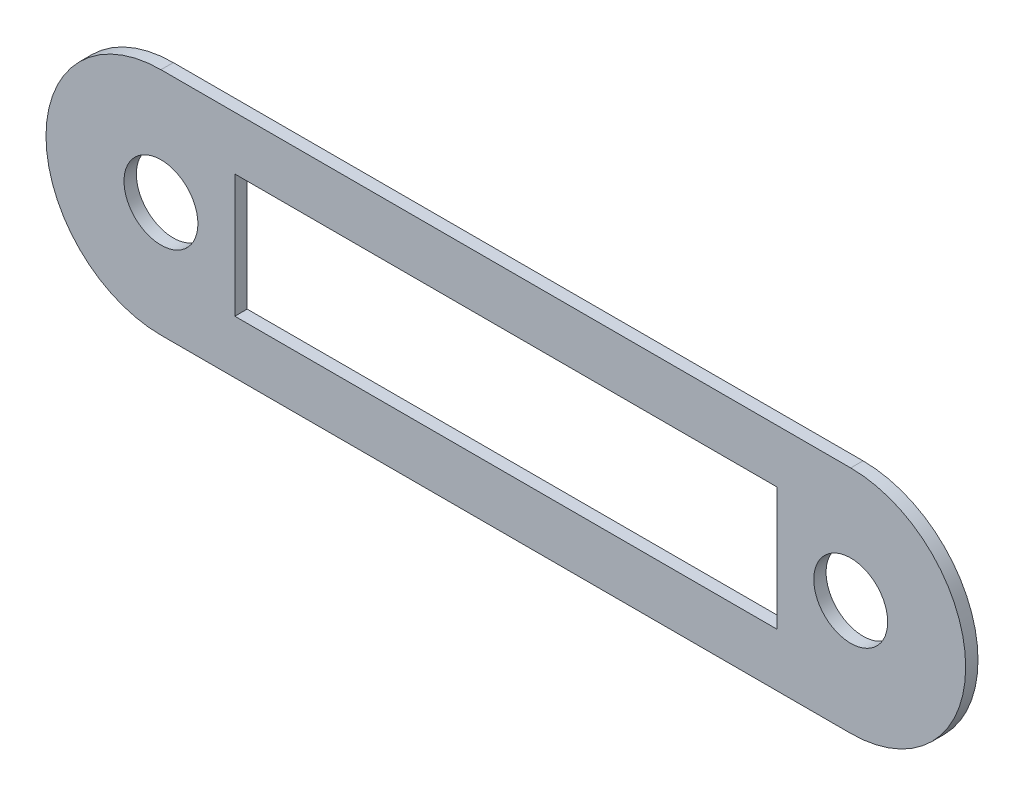
ISO-10303-21;
HEADER;
FILE_DESCRIPTION(('STEP AP214'),'2;1');
FILE_NAME('part.step','',(''),(''),'','','');
FILE_SCHEMA(('AUTOMOTIVE_DESIGN { 1 0 10303 214 1 1 1 1 }'));
ENDSEC;
DATA;
#1=APPLICATION_CONTEXT('core data for automotive mechanical design processes');
#2=APPLICATION_PROTOCOL_DEFINITION('international standard','automotive_design',2000,#1);
#3=PRODUCT_CONTEXT('',#1,'mechanical');
#4=PRODUCT('Part','Part','',(#3));
#5=PRODUCT_RELATED_PRODUCT_CATEGORY('part','',(#4));
#6=PRODUCT_DEFINITION_FORMATION('','',#4);
#7=PRODUCT_DEFINITION_CONTEXT('part definition',#1,'design');
#8=PRODUCT_DEFINITION('design','',#6,#7);
#9=PRODUCT_DEFINITION_SHAPE('','',#8);
#10=(LENGTH_UNIT() NAMED_UNIT(*) SI_UNIT(.MILLI.,.METRE.));
#11=(NAMED_UNIT(*) PLANE_ANGLE_UNIT() SI_UNIT($,.RADIAN.));
#12=(NAMED_UNIT(*) SI_UNIT($,.STERADIAN.) SOLID_ANGLE_UNIT());
#13=UNCERTAINTY_MEASURE_WITH_UNIT(LENGTH_MEASURE(1.E-05),#10,'distance_accuracy_value','');
#14=(GEOMETRIC_REPRESENTATION_CONTEXT(3) GLOBAL_UNCERTAINTY_ASSIGNED_CONTEXT((#13)) GLOBAL_UNIT_ASSIGNED_CONTEXT((#10,
#11,#12)) REPRESENTATION_CONTEXT('',''));
#15=CARTESIAN_POINT('',(0.,0.,0.));
#16=DIRECTION('',(0.,0.,1.));
#17=DIRECTION('',(1.,0.,0.));
#18=AXIS2_PLACEMENT_3D('',#15,#16,#17);
#19=CARTESIAN_POINT('',(0.,0.,0.5));
#20=DIRECTION('',(0.,0.,1.));
#21=DIRECTION('',(1.,0.,0.));
#22=AXIS2_PLACEMENT_3D('',#19,#20,#21);
#23=PLANE('',#22);
#24=CARTESIAN_POINT('',(28.,0.,0.5));
#25=DIRECTION('',(0.,0.,1.));
#26=DIRECTION('',(1.,0.,0.));
#27=AXIS2_PLACEMENT_3D('',#24,#25,#26);
#28=CIRCLE('',#27,1.5);
#29=CARTESIAN_POINT('',(29.5,0.,0.5));
#30=VERTEX_POINT('',#29);
#31=EDGE_CURVE('E115',#30,#30,#28,.T.);
#32=ORIENTED_EDGE('',*,*,#31,.F.);
#33=EDGE_LOOP('',(#32));
#34=FACE_BOUND('',#33,.T.);
#35=CARTESIAN_POINT('',(0.,0.,0.5));
#36=DIRECTION('',(0.,0.,1.));
#37=DIRECTION('',(1.,0.,0.));
#38=AXIS2_PLACEMENT_3D('',#35,#36,#37);
#39=CIRCLE('',#38,1.5);
#40=CARTESIAN_POINT('',(1.5,0.,0.5));
#41=VERTEX_POINT('',#40);
#42=EDGE_CURVE('E138',#41,#41,#39,.T.);
#43=ORIENTED_EDGE('',*,*,#42,.F.);
#44=EDGE_LOOP('',(#43));
#45=FACE_BOUND('',#44,.T.);
#46=CARTESIAN_POINT('',(0.,0.,0.5));
#47=DIRECTION('',(0.,0.,1.));
#48=DIRECTION('',(1.,0.,0.));
#49=AXIS2_PLACEMENT_3D('',#46,#47,#48);
#50=CIRCLE('',#49,4.66666666666667);
#51=CARTESIAN_POINT('',(0.,4.66666666666667,0.5));
#52=VERTEX_POINT('',#51);
#53=CARTESIAN_POINT('',(0.,-4.66666666666667,0.5));
#54=VERTEX_POINT('',#53);
#55=EDGE_CURVE('E147',#52,#54,#50,.T.);
#56=ORIENTED_EDGE('',*,*,#55,.T.);
#57=DIRECTION('',(1.,0.,0.));
#58=VECTOR('',#57,1.);
#59=CARTESIAN_POINT('',(0.,-4.66666666666667,0.5));
#60=LINE('',#59,#58);
#61=CARTESIAN_POINT('',(28.,-4.66666666666667,0.5));
#62=VERTEX_POINT('',#61);
#63=EDGE_CURVE('E150',#54,#62,#60,.T.);
#64=ORIENTED_EDGE('',*,*,#63,.T.);
#65=CARTESIAN_POINT('',(28.,0.,0.5));
#66=DIRECTION('',(0.,0.,1.));
#67=DIRECTION('',(1.,0.,0.));
#68=AXIS2_PLACEMENT_3D('',#65,#66,#67);
#69=CIRCLE('',#68,4.66666666666667);
#70=CARTESIAN_POINT('',(28.,4.66666666666667,0.5));
#71=VERTEX_POINT('',#70);
#72=EDGE_CURVE('E153',#62,#71,#69,.T.);
#73=ORIENTED_EDGE('',*,*,#72,.T.);
#74=DIRECTION('',(-1.,0.,0.));
#75=VECTOR('',#74,1.);
#76=CARTESIAN_POINT('',(0.,4.66666666666667,0.5));
#77=LINE('',#76,#75);
#78=EDGE_CURVE('E155',#71,#52,#77,.T.);
#79=ORIENTED_EDGE('',*,*,#78,.T.);
#80=EDGE_LOOP('',(#56,#64,#73,#79));
#81=FACE_BOUND('',#80,.T.);
#82=DIRECTION('',(-1.,0.,0.));
#83=VECTOR('',#82,1.);
#84=CARTESIAN_POINT('',(25.,2.5,0.5));
#85=LINE('',#84,#83);
#86=CARTESIAN_POINT('',(25.,2.5,0.5));
#87=VERTEX_POINT('',#86);
#88=CARTESIAN_POINT('',(3.,2.5,0.5));
#89=VERTEX_POINT('',#88);
#90=EDGE_CURVE('E109',#87,#89,#85,.T.);
#91=ORIENTED_EDGE('',*,*,#90,.F.);
#92=DIRECTION('',(0.,-1.,0.));
#93=VECTOR('',#92,1.);
#94=CARTESIAN_POINT('',(25.,2.5,0.5));
#95=LINE('',#94,#93);
#96=CARTESIAN_POINT('',(25.,-2.5,0.5));
#97=VERTEX_POINT('',#96);
#98=EDGE_CURVE('E49',#87,#97,#95,.T.);
#99=ORIENTED_EDGE('',*,*,#98,.T.);
#100=DIRECTION('',(-1.,0.,0.));
#101=VECTOR('',#100,1.);
#102=CARTESIAN_POINT('',(25.,-2.5,0.5));
#103=LINE('',#102,#101);
#104=CARTESIAN_POINT('',(3.,-2.5,0.5));
#105=VERTEX_POINT('',#104);
#106=EDGE_CURVE('E114',#97,#105,#103,.T.);
#107=ORIENTED_EDGE('',*,*,#106,.T.);
#108=DIRECTION('',(0.,-1.,0.));
#109=VECTOR('',#108,1.);
#110=CARTESIAN_POINT('',(3.,2.5,0.5));
#111=LINE('',#110,#109);
#112=EDGE_CURVE('E126',#89,#105,#111,.T.);
#113=ORIENTED_EDGE('',*,*,#112,.F.);
#114=EDGE_LOOP('',(#91,#99,#107,#113));
#115=FACE_BOUND('',#114,.T.);
#116=ADVANCED_FACE('F34',(#34,#45,#81,#115),#23,.T.);
#117=CARTESIAN_POINT('',(0.,0.,0.));
#118=DIRECTION('',(0.,0.,1.));
#119=DIRECTION('',(1.,0.,0.));
#120=AXIS2_PLACEMENT_3D('',#117,#118,#119);
#121=PLANE('',#120);
#122=CARTESIAN_POINT('',(0.,0.,0.));
#123=DIRECTION('',(0.,0.,1.));
#124=DIRECTION('',(1.,0.,0.));
#125=AXIS2_PLACEMENT_3D('',#122,#123,#124);
#126=CIRCLE('',#125,4.66666666666667);
#127=CARTESIAN_POINT('',(0.,4.66666666666667,0.));
#128=VERTEX_POINT('',#127);
#129=CARTESIAN_POINT('',(0.,-4.66666666666667,0.));
#130=VERTEX_POINT('',#129);
#131=EDGE_CURVE('E144',#128,#130,#126,.T.);
#132=ORIENTED_EDGE('',*,*,#131,.F.);
#133=DIRECTION('',(-1.,0.,0.));
#134=VECTOR('',#133,1.);
#135=CARTESIAN_POINT('',(0.,4.66666666666667,0.));
#136=LINE('',#135,#134);
#137=CARTESIAN_POINT('',(28.,4.66666666666667,0.));
#138=VERTEX_POINT('',#137);
#139=EDGE_CURVE('E151',#138,#128,#136,.T.);
#140=ORIENTED_EDGE('',*,*,#139,.F.);
#141=CARTESIAN_POINT('',(28.,0.,0.));
#142=DIRECTION('',(0.,0.,1.));
#143=DIRECTION('',(1.,0.,0.));
#144=AXIS2_PLACEMENT_3D('',#141,#142,#143);
#145=CIRCLE('',#144,4.66666666666667);
#146=CARTESIAN_POINT('',(28.,-4.66666666666667,0.));
#147=VERTEX_POINT('',#146);
#148=EDGE_CURVE('E162',#147,#138,#145,.T.);
#149=ORIENTED_EDGE('',*,*,#148,.F.);
#150=DIRECTION('',(1.,0.,0.));
#151=VECTOR('',#150,1.);
#152=CARTESIAN_POINT('',(0.,-4.66666666666667,0.));
#153=LINE('',#152,#151);
#154=EDGE_CURVE('E160',#130,#147,#153,.T.);
#155=ORIENTED_EDGE('',*,*,#154,.F.);
#156=EDGE_LOOP('',(#132,#140,#149,#155));
#157=FACE_BOUND('',#156,.T.);
#158=CARTESIAN_POINT('',(0.,0.,0.));
#159=DIRECTION('',(0.,0.,1.));
#160=DIRECTION('',(1.,0.,0.));
#161=AXIS2_PLACEMENT_3D('',#158,#159,#160);
#162=CIRCLE('',#161,1.5);
#163=CARTESIAN_POINT('',(1.5,0.,0.));
#164=VERTEX_POINT('',#163);
#165=EDGE_CURVE('E141',#164,#164,#162,.T.);
#166=ORIENTED_EDGE('',*,*,#165,.T.);
#167=EDGE_LOOP('',(#166));
#168=FACE_BOUND('',#167,.T.);
#169=CARTESIAN_POINT('',(28.,0.,0.));
#170=DIRECTION('',(0.,0.,1.));
#171=DIRECTION('',(1.,0.,0.));
#172=AXIS2_PLACEMENT_3D('',#169,#170,#171);
#173=CIRCLE('',#172,1.5);
#174=CARTESIAN_POINT('',(29.5,0.,0.));
#175=VERTEX_POINT('',#174);
#176=EDGE_CURVE('E135',#175,#175,#173,.T.);
#177=ORIENTED_EDGE('',*,*,#176,.T.);
#178=EDGE_LOOP('',(#177));
#179=FACE_BOUND('',#178,.T.);
#180=DIRECTION('',(0.,-1.,0.));
#181=VECTOR('',#180,1.);
#182=CARTESIAN_POINT('',(25.,2.5,0.));
#183=LINE('',#182,#181);
#184=CARTESIAN_POINT('',(25.,2.5,0.));
#185=VERTEX_POINT('',#184);
#186=CARTESIAN_POINT('',(25.,-2.5,0.));
#187=VERTEX_POINT('',#186);
#188=EDGE_CURVE('E99',#185,#187,#183,.T.);
#189=ORIENTED_EDGE('',*,*,#188,.F.);
#190=DIRECTION('',(-1.,0.,0.));
#191=VECTOR('',#190,1.);
#192=CARTESIAN_POINT('',(25.,2.5,0.));
#193=LINE('',#192,#191);
#194=CARTESIAN_POINT('',(3.,2.5,0.));
#195=VERTEX_POINT('',#194);
#196=EDGE_CURVE('E120',#185,#195,#193,.T.);
#197=ORIENTED_EDGE('',*,*,#196,.T.);
#198=DIRECTION('',(0.,-1.,0.));
#199=VECTOR('',#198,1.);
#200=CARTESIAN_POINT('',(3.,2.5,0.));
#201=LINE('',#200,#199);
#202=CARTESIAN_POINT('',(3.,-2.5,0.));
#203=VERTEX_POINT('',#202);
#204=EDGE_CURVE('E57',#195,#203,#201,.T.);
#205=ORIENTED_EDGE('',*,*,#204,.T.);
#206=DIRECTION('',(-1.,0.,0.));
#207=VECTOR('',#206,1.);
#208=CARTESIAN_POINT('',(25.,-2.5,0.));
#209=LINE('',#208,#207);
#210=EDGE_CURVE('E108',#187,#203,#209,.T.);
#211=ORIENTED_EDGE('',*,*,#210,.F.);
#212=EDGE_LOOP('',(#189,#197,#205,#211));
#213=FACE_BOUND('',#212,.T.);
#214=ADVANCED_FACE('F118',(#157,#168,#179,#213),#121,.F.);
#215=CARTESIAN_POINT('',(0.,0.,0.5));
#216=DIRECTION('',(0.,0.,-1.));
#217=DIRECTION('',(-1.,0.,0.));
#218=AXIS2_PLACEMENT_3D('',#215,#216,#217);
#219=CYLINDRICAL_SURFACE('',#218,4.66666666666667);
#220=ORIENTED_EDGE('',*,*,#131,.T.);
#221=DIRECTION('',(0.,0.,-1.));
#222=VECTOR('',#221,1.);
#223=CARTESIAN_POINT('',(0.,-4.66666666666667,0.5));
#224=LINE('',#223,#222);
#225=EDGE_CURVE('E11',#54,#130,#224,.T.);
#226=ORIENTED_EDGE('',*,*,#225,.F.);
#227=ORIENTED_EDGE('',*,*,#55,.F.);
#228=DIRECTION('',(0.,0.,-1.));
#229=VECTOR('',#228,1.);
#230=CARTESIAN_POINT('',(0.,4.66666666666667,0.5));
#231=LINE('',#230,#229);
#232=EDGE_CURVE('E157',#52,#128,#231,.T.);
#233=ORIENTED_EDGE('',*,*,#232,.T.);
#234=EDGE_LOOP('',(#220,#226,#227,#233));
#235=FACE_BOUND('',#234,.T.);
#236=ADVANCED_FACE('F36',(#235),#219,.T.);
#237=CARTESIAN_POINT('',(0.,-4.66666666666667,0.5));
#238=DIRECTION('',(0.,1.,0.));
#239=DIRECTION('',(0.,0.,1.));
#240=AXIS2_PLACEMENT_3D('',#237,#238,#239);
#241=PLANE('',#240);
#242=ORIENTED_EDGE('',*,*,#154,.T.);
#243=DIRECTION('',(0.,0.,-1.));
#244=VECTOR('',#243,1.);
#245=CARTESIAN_POINT('',(28.,-4.66666666666667,0.5));
#246=LINE('',#245,#244);
#247=EDGE_CURVE('E42',#62,#147,#246,.T.);
#248=ORIENTED_EDGE('',*,*,#247,.F.);
#249=ORIENTED_EDGE('',*,*,#63,.F.);
#250=ORIENTED_EDGE('',*,*,#225,.T.);
#251=EDGE_LOOP('',(#242,#248,#249,#250));
#252=FACE_BOUND('',#251,.T.);
#253=ADVANCED_FACE('F190',(#252),#241,.F.);
#254=CARTESIAN_POINT('',(28.,0.,0.5));
#255=DIRECTION('',(0.,0.,-1.));
#256=DIRECTION('',(-1.,0.,0.));
#257=AXIS2_PLACEMENT_3D('',#254,#255,#256);
#258=CYLINDRICAL_SURFACE('',#257,4.66666666666667);
#259=ORIENTED_EDGE('',*,*,#148,.T.);
#260=DIRECTION('',(0.,0.,-1.));
#261=VECTOR('',#260,1.);
#262=CARTESIAN_POINT('',(28.,4.66666666666667,0.5));
#263=LINE('',#262,#261);
#264=EDGE_CURVE('E167',#71,#138,#263,.T.);
#265=ORIENTED_EDGE('',*,*,#264,.F.);
#266=ORIENTED_EDGE('',*,*,#72,.F.);
#267=ORIENTED_EDGE('',*,*,#247,.T.);
#268=EDGE_LOOP('',(#259,#265,#266,#267));
#269=FACE_BOUND('',#268,.T.);
#270=ADVANCED_FACE('F174',(#269),#258,.T.);
#271=CARTESIAN_POINT('',(0.,4.66666666666667,0.5));
#272=DIRECTION('',(0.,-1.,0.));
#273=DIRECTION('',(0.,0.,-1.));
#274=AXIS2_PLACEMENT_3D('',#271,#272,#273);
#275=PLANE('',#274);
#276=ORIENTED_EDGE('',*,*,#139,.T.);
#277=ORIENTED_EDGE('',*,*,#232,.F.);
#278=ORIENTED_EDGE('',*,*,#78,.F.);
#279=ORIENTED_EDGE('',*,*,#264,.T.);
#280=EDGE_LOOP('',(#276,#277,#278,#279));
#281=FACE_BOUND('',#280,.T.);
#282=ADVANCED_FACE('F183',(#281),#275,.F.);
#283=CARTESIAN_POINT('',(0.,0.,0.));
#284=DIRECTION('',(0.,0.,1.));
#285=DIRECTION('',(1.,0.,0.));
#286=AXIS2_PLACEMENT_3D('',#283,#284,#285);
#287=CYLINDRICAL_SURFACE('',#286,1.5);
#288=ORIENTED_EDGE('',*,*,#165,.F.);
#289=EDGE_LOOP('',(#288));
#290=FACE_BOUND('',#289,.T.);
#291=ORIENTED_EDGE('',*,*,#42,.T.);
#292=EDGE_LOOP('',(#291));
#293=FACE_BOUND('',#292,.T.);
#294=ADVANCED_FACE('F207',(#290,#293),#287,.F.);
#295=CARTESIAN_POINT('',(28.,0.,0.));
#296=DIRECTION('',(0.,0.,1.));
#297=DIRECTION('',(1.,0.,0.));
#298=AXIS2_PLACEMENT_3D('',#295,#296,#297);
#299=CYLINDRICAL_SURFACE('',#298,1.5);
#300=ORIENTED_EDGE('',*,*,#176,.F.);
#301=EDGE_LOOP('',(#300));
#302=FACE_BOUND('',#301,.T.);
#303=ORIENTED_EDGE('',*,*,#31,.T.);
#304=EDGE_LOOP('',(#303));
#305=FACE_BOUND('',#304,.T.);
#306=ADVANCED_FACE('F214',(#302,#305),#299,.F.);
#307=CARTESIAN_POINT('',(25.,2.5,0.));
#308=DIRECTION('',(-1.,0.,0.));
#309=DIRECTION('',(0.,-1.,0.));
#310=AXIS2_PLACEMENT_3D('',#307,#308,#309);
#311=PLANE('',#310);
#312=ORIENTED_EDGE('',*,*,#98,.F.);
#313=DIRECTION('',(0.,0.,1.));
#314=VECTOR('',#313,1.);
#315=CARTESIAN_POINT('',(25.,2.5,0.));
#316=LINE('',#315,#314);
#317=EDGE_CURVE('E103',#185,#87,#316,.T.);
#318=ORIENTED_EDGE('',*,*,#317,.F.);
#319=ORIENTED_EDGE('',*,*,#188,.T.);
#320=DIRECTION('',(0.,0.,1.));
#321=VECTOR('',#320,1.);
#322=CARTESIAN_POINT('',(25.,-2.5,0.));
#323=LINE('',#322,#321);
#324=EDGE_CURVE('E102',#187,#97,#323,.T.);
#325=ORIENTED_EDGE('',*,*,#324,.T.);
#326=EDGE_LOOP('',(#312,#318,#319,#325));
#327=FACE_BOUND('',#326,.T.);
#328=ADVANCED_FACE('F101',(#327),#311,.T.);
#329=CARTESIAN_POINT('',(25.,-2.5,0.));
#330=DIRECTION('',(0.,1.,0.));
#331=DIRECTION('',(-1.,0.,0.));
#332=AXIS2_PLACEMENT_3D('',#329,#330,#331);
#333=PLANE('',#332);
#334=ORIENTED_EDGE('',*,*,#106,.F.);
#335=ORIENTED_EDGE('',*,*,#324,.F.);
#336=ORIENTED_EDGE('',*,*,#210,.T.);
#337=DIRECTION('',(0.,0.,1.));
#338=VECTOR('',#337,1.);
#339=CARTESIAN_POINT('',(3.,-2.5,0.));
#340=LINE('',#339,#338);
#341=EDGE_CURVE('E116',#203,#105,#340,.T.);
#342=ORIENTED_EDGE('',*,*,#341,.T.);
#343=EDGE_LOOP('',(#334,#335,#336,#342));
#344=FACE_BOUND('',#343,.T.);
#345=ADVANCED_FACE('F112',(#344),#333,.T.);
#346=CARTESIAN_POINT('',(3.,2.5,0.));
#347=DIRECTION('',(-1.,0.,0.));
#348=DIRECTION('',(0.,-1.,0.));
#349=AXIS2_PLACEMENT_3D('',#346,#347,#348);
#350=PLANE('',#349);
#351=ORIENTED_EDGE('',*,*,#112,.T.);
#352=ORIENTED_EDGE('',*,*,#341,.F.);
#353=ORIENTED_EDGE('',*,*,#204,.F.);
#354=DIRECTION('',(0.,0.,1.));
#355=VECTOR('',#354,1.);
#356=CARTESIAN_POINT('',(3.,2.5,0.));
#357=LINE('',#356,#355);
#358=EDGE_CURVE('E132',#195,#89,#357,.T.);
#359=ORIENTED_EDGE('',*,*,#358,.T.);
#360=EDGE_LOOP('',(#351,#352,#353,#359));
#361=FACE_BOUND('',#360,.T.);
#362=ADVANCED_FACE('F233',(#361),#350,.F.);
#363=CARTESIAN_POINT('',(25.,2.5,0.));
#364=DIRECTION('',(0.,1.,0.));
#365=DIRECTION('',(-1.,0.,0.));
#366=AXIS2_PLACEMENT_3D('',#363,#364,#365);
#367=PLANE('',#366);
#368=ORIENTED_EDGE('',*,*,#90,.T.);
#369=ORIENTED_EDGE('',*,*,#358,.F.);
#370=ORIENTED_EDGE('',*,*,#196,.F.);
#371=ORIENTED_EDGE('',*,*,#317,.T.);
#372=EDGE_LOOP('',(#368,#369,#370,#371));
#373=FACE_BOUND('',#372,.T.);
#374=ADVANCED_FACE('F236',(#373),#367,.F.);
#375=CLOSED_SHELL('',(#116,#214,#236,#253,#270,#282,#294,#306,#328,#345,#362,#374));
#376=MANIFOLD_SOLID_BREP('B2',#375);
#377=ADVANCED_BREP_SHAPE_REPRESENTATION('',(#18,#376),#14);
#378=SHAPE_DEFINITION_REPRESENTATION(#9,#377);
ENDSEC;
END-ISO-10303-21;
